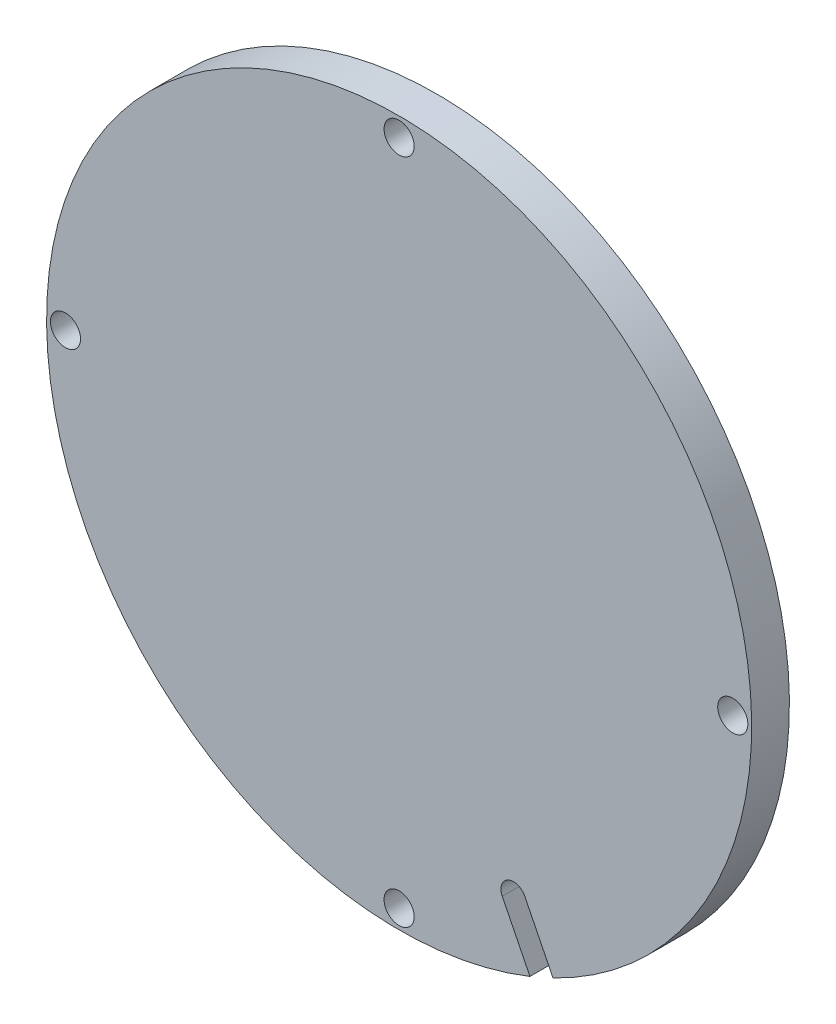
ISO-10303-21;
HEADER;
FILE_DESCRIPTION(('STEP AP214'),'2;1');
FILE_NAME('part.step','',(''),(''),'','','');
FILE_SCHEMA(('AUTOMOTIVE_DESIGN { 1 0 10303 214 1 1 1 1 }'));
ENDSEC;
DATA;
#1=APPLICATION_CONTEXT('core data for automotive mechanical design processes');
#2=APPLICATION_PROTOCOL_DEFINITION('international standard','automotive_design',2000,#1);
#3=PRODUCT_CONTEXT('',#1,'mechanical');
#4=PRODUCT('Part','Part','',(#3));
#5=PRODUCT_RELATED_PRODUCT_CATEGORY('part','',(#4));
#6=PRODUCT_DEFINITION_FORMATION('','',#4);
#7=PRODUCT_DEFINITION_CONTEXT('part definition',#1,'design');
#8=PRODUCT_DEFINITION('design','',#6,#7);
#9=PRODUCT_DEFINITION_SHAPE('','',#8);
#10=(LENGTH_UNIT() NAMED_UNIT(*) SI_UNIT(.MILLI.,.METRE.));
#11=(NAMED_UNIT(*) PLANE_ANGLE_UNIT() SI_UNIT($,.RADIAN.));
#12=(NAMED_UNIT(*) SI_UNIT($,.STERADIAN.) SOLID_ANGLE_UNIT());
#13=UNCERTAINTY_MEASURE_WITH_UNIT(LENGTH_MEASURE(1.E-05),#10,'distance_accuracy_value','');
#14=(GEOMETRIC_REPRESENTATION_CONTEXT(3) GLOBAL_UNCERTAINTY_ASSIGNED_CONTEXT((#13)) GLOBAL_UNIT_ASSIGNED_CONTEXT((#10,
#11,#12)) REPRESENTATION_CONTEXT('',''));
#15=CARTESIAN_POINT('',(0.,0.,0.));
#16=DIRECTION('',(0.,0.,1.));
#17=DIRECTION('',(1.,0.,0.));
#18=AXIS2_PLACEMENT_3D('',#15,#16,#17);
#19=CARTESIAN_POINT('',(0.,0.,4.7625));
#20=DIRECTION('',(0.,0.,-1.));
#21=DIRECTION('',(-1.,0.,0.));
#22=AXIS2_PLACEMENT_3D('',#19,#20,#21);
#23=CYLINDRICAL_SURFACE('',#22,44.45);
#24=CARTESIAN_POINT('',(0.,0.,4.7625));
#25=DIRECTION('',(0.,0.,1.));
#26=DIRECTION('',(1.,0.,0.));
#27=AXIS2_PLACEMENT_3D('',#24,#25,#26);
#28=CIRCLE('',#27,44.45);
#29=CARTESIAN_POINT('',(19.4009427230963,-39.9925733287461,4.7625));
#30=VERTEX_POINT('',#29);
#31=CARTESIAN_POINT('',(16.4941189354782,-41.276464729217,4.7625));
#32=VERTEX_POINT('',#31);
#33=EDGE_CURVE('E101',#30,#32,#28,.T.);
#34=ORIENTED_EDGE('',*,*,#33,.F.);
#35=DIRECTION('',(0.,0.,1.));
#36=VECTOR('',#35,1.);
#37=CARTESIAN_POINT('',(19.4009427230961,-39.9925733287462,2.381256));
#38=LINE('',#37,#36);
#39=CARTESIAN_POINT('',(19.4009427230961,-39.9925733287462,0.));
#40=VERTEX_POINT('',#39);
#41=EDGE_CURVE('E88',#30,#40,#38,.F.);
#42=ORIENTED_EDGE('',*,*,#41,.T.);
#43=CARTESIAN_POINT('',(0.,0.,0.));
#44=DIRECTION('',(0.,0.,1.));
#45=DIRECTION('',(1.,0.,0.));
#46=AXIS2_PLACEMENT_3D('',#43,#44,#45);
#47=CIRCLE('',#46,44.45);
#48=CARTESIAN_POINT('',(16.4941189354782,-41.276464729217,0.));
#49=VERTEX_POINT('',#48);
#50=EDGE_CURVE('E99',#40,#49,#47,.T.);
#51=ORIENTED_EDGE('',*,*,#50,.T.);
#52=DIRECTION('',(0.,0.,-1.));
#53=VECTOR('',#52,1.);
#54=CARTESIAN_POINT('',(16.4941189354782,-41.276464729217,4.7625));
#55=LINE('',#54,#53);
#56=EDGE_CURVE('E78',#32,#49,#55,.T.);
#57=ORIENTED_EDGE('',*,*,#56,.F.);
#58=EDGE_LOOP('',(#34,#42,#51,#57));
#59=FACE_BOUND('',#58,.T.);
#60=ADVANCED_FACE('F33',(#59),#23,.T.);
#61=CARTESIAN_POINT('',(0.,0.,4.7625));
#62=DIRECTION('',(0.,0.,1.));
#63=DIRECTION('',(1.,0.,0.));
#64=AXIS2_PLACEMENT_3D('',#61,#62,#63);
#65=PLANE('',#64);
#66=CARTESIAN_POINT('',(17.9604912281249,-40.6598481901303,4.7625));
#67=DIRECTION('',(0.,0.,1.));
#68=DIRECTION('',(1.,0.,0.));
#69=AXIS2_PLACEMENT_3D('',#66,#67,#68);
#70=CIRCLE('',#69,1.58749999999999);
#71=CARTESIAN_POINT('',(19.3816166533917,-39.9523464052136,4.7625));
#72=VERTEX_POINT('',#71);
#73=EDGE_CURVE('E103',#30,#72,#70,.T.);
#74=ORIENTED_EDGE('',*,*,#73,.F.);
#75=ORIENTED_EDGE('',*,*,#33,.T.);
#76=DIRECTION('',(-0.445670415695608,0.895197118278262,0.));
#77=VECTOR('',#76,1.);
#78=CARTESIAN_POINT('',(-3.24975483302059,-1.61787784809524,4.7625));
#79=LINE('',#78,#77);
#80=CARTESIAN_POINT('',(13.0018568782743,-34.2617228487134,4.7625));
#81=VERTEX_POINT('',#80);
#82=EDGE_CURVE('E115',#32,#81,#79,.T.);
#83=ORIENTED_EDGE('',*,*,#82,.T.);
#84=CARTESIAN_POINT('',(14.4229823035411,-33.5542210637966,4.7625));
#85=DIRECTION('',(0.,0.,1.));
#86=DIRECTION('',(1.,0.,0.));
#87=AXIS2_PLACEMENT_3D('',#84,#85,#86);
#88=CIRCLE('',#87,1.5875);
#89=CARTESIAN_POINT('',(15.8441077288078,-32.8467192788799,4.7625));
#90=VERTEX_POINT('',#89);
#91=EDGE_CURVE('E36',#90,#81,#88,.T.);
#92=ORIENTED_EDGE('',*,*,#91,.F.);
#93=DIRECTION('',(-0.445670415695605,0.895197118278263,0.));
#94=VECTOR('',#93,1.);
#95=CARTESIAN_POINT('',(19.3816166533917,-39.9523464052136,4.7625));
#96=LINE('',#95,#94);
#97=EDGE_CURVE('E66',#72,#90,#96,.T.);
#98=ORIENTED_EDGE('',*,*,#97,.F.);
#99=EDGE_LOOP('',(#74,#75,#83,#92,#98));
#100=FACE_BOUND('',#99,.T.);
#101=CARTESIAN_POINT('',(42.06875,4.40646766720371E-13,4.7625));
#102=DIRECTION('',(0.,0.,1.));
#103=DIRECTION('',(1.,0.,0.));
#104=AXIS2_PLACEMENT_3D('',#101,#102,#103);
#105=CIRCLE('',#104,1.89865);
#106=CARTESIAN_POINT('',(43.9674,4.40646766720371E-13,4.7625));
#107=VERTEX_POINT('',#106);
#108=EDGE_CURVE('E102',#107,#107,#105,.T.);
#109=ORIENTED_EDGE('',*,*,#108,.F.);
#110=EDGE_LOOP('',(#109));
#111=FACE_BOUND('',#110,.T.);
#112=CARTESIAN_POINT('',(0.,-42.06875,4.7625));
#113=DIRECTION('',(0.,0.,1.));
#114=DIRECTION('',(1.,0.,0.));
#115=AXIS2_PLACEMENT_3D('',#112,#113,#114);
#116=CIRCLE('',#115,1.89865);
#117=CARTESIAN_POINT('',(1.89865,-42.06875,4.7625));
#118=VERTEX_POINT('',#117);
#119=EDGE_CURVE('E131',#118,#118,#116,.T.);
#120=ORIENTED_EDGE('',*,*,#119,.F.);
#121=EDGE_LOOP('',(#120));
#122=FACE_BOUND('',#121,.T.);
#123=CARTESIAN_POINT('',(-42.06875,-1.46882255573457E-13,4.7625));
#124=DIRECTION('',(0.,0.,1.));
#125=DIRECTION('',(1.,0.,0.));
#126=AXIS2_PLACEMENT_3D('',#123,#124,#125);
#127=CIRCLE('',#126,1.89865);
#128=CARTESIAN_POINT('',(-40.1701,-1.46882255573457E-13,4.7625));
#129=VERTEX_POINT('',#128);
#130=EDGE_CURVE('E137',#129,#129,#127,.T.);
#131=ORIENTED_EDGE('',*,*,#130,.F.);
#132=EDGE_LOOP('',(#131));
#133=FACE_BOUND('',#132,.T.);
#134=CARTESIAN_POINT('',(0.,42.06875,4.7625));
#135=DIRECTION('',(0.,0.,1.));
#136=DIRECTION('',(1.,0.,0.));
#137=AXIS2_PLACEMENT_3D('',#134,#135,#136);
#138=CIRCLE('',#137,1.89865);
#139=CARTESIAN_POINT('',(1.89865,42.06875,4.7625));
#140=VERTEX_POINT('',#139);
#141=EDGE_CURVE('E110',#140,#140,#138,.T.);
#142=ORIENTED_EDGE('',*,*,#141,.F.);
#143=EDGE_LOOP('',(#142));
#144=FACE_BOUND('',#143,.T.);
#145=ADVANCED_FACE('F148',(#100,#111,#122,#133,#144),#65,.T.);
#146=CARTESIAN_POINT('',(0.,0.,0.));
#147=DIRECTION('',(0.,0.,1.));
#148=DIRECTION('',(1.,0.,0.));
#149=AXIS2_PLACEMENT_3D('',#146,#147,#148);
#150=PLANE('',#149);
#151=CARTESIAN_POINT('',(42.06875,4.40646766720371E-13,0.));
#152=DIRECTION('',(0.,0.,1.));
#153=DIRECTION('',(1.,0.,0.));
#154=AXIS2_PLACEMENT_3D('',#151,#152,#153);
#155=CIRCLE('',#154,1.89865);
#156=CARTESIAN_POINT('',(43.9674,4.40646766720371E-13,0.));
#157=VERTEX_POINT('',#156);
#158=EDGE_CURVE('E128',#157,#157,#155,.T.);
#159=ORIENTED_EDGE('',*,*,#158,.T.);
#160=EDGE_LOOP('',(#159));
#161=FACE_BOUND('',#160,.T.);
#162=CARTESIAN_POINT('',(0.,-42.06875,0.));
#163=DIRECTION('',(0.,0.,1.));
#164=DIRECTION('',(1.,0.,0.));
#165=AXIS2_PLACEMENT_3D('',#162,#163,#164);
#166=CIRCLE('',#165,1.89865);
#167=CARTESIAN_POINT('',(1.89865,-42.06875,0.));
#168=VERTEX_POINT('',#167);
#169=EDGE_CURVE('E134',#168,#168,#166,.T.);
#170=ORIENTED_EDGE('',*,*,#169,.T.);
#171=EDGE_LOOP('',(#170));
#172=FACE_BOUND('',#171,.T.);
#173=CARTESIAN_POINT('',(-42.06875,-1.46882255573457E-13,0.));
#174=DIRECTION('',(0.,0.,1.));
#175=DIRECTION('',(1.,0.,0.));
#176=AXIS2_PLACEMENT_3D('',#173,#174,#175);
#177=CIRCLE('',#176,1.89865);
#178=CARTESIAN_POINT('',(-40.1701,-1.46882255573457E-13,0.));
#179=VERTEX_POINT('',#178);
#180=EDGE_CURVE('E140',#179,#179,#177,.T.);
#181=ORIENTED_EDGE('',*,*,#180,.T.);
#182=EDGE_LOOP('',(#181));
#183=FACE_BOUND('',#182,.T.);
#184=CARTESIAN_POINT('',(0.,42.06875,0.));
#185=DIRECTION('',(0.,0.,1.));
#186=DIRECTION('',(1.,0.,0.));
#187=AXIS2_PLACEMENT_3D('',#184,#185,#186);
#188=CIRCLE('',#187,1.89865);
#189=CARTESIAN_POINT('',(1.89865,42.06875,0.));
#190=VERTEX_POINT('',#189);
#191=EDGE_CURVE('E106',#190,#190,#188,.T.);
#192=ORIENTED_EDGE('',*,*,#191,.T.);
#193=EDGE_LOOP('',(#192));
#194=FACE_BOUND('',#193,.T.);
#195=ORIENTED_EDGE('',*,*,#50,.F.);
#196=CARTESIAN_POINT('',(17.9604912281249,-40.6598481901303,0.));
#197=DIRECTION('',(0.,0.,1.));
#198=DIRECTION('',(1.,0.,0.));
#199=AXIS2_PLACEMENT_3D('',#196,#197,#198);
#200=CIRCLE('',#199,1.58749999999999);
#201=CARTESIAN_POINT('',(19.3816166533917,-39.9523464052136,0.));
#202=VERTEX_POINT('',#201);
#203=EDGE_CURVE('E11',#40,#202,#200,.T.);
#204=ORIENTED_EDGE('',*,*,#203,.T.);
#205=DIRECTION('',(-0.445670415695605,0.895197118278263,0.));
#206=VECTOR('',#205,1.);
#207=CARTESIAN_POINT('',(19.3816166533917,-39.9523464052136,0.));
#208=LINE('',#207,#206);
#209=CARTESIAN_POINT('',(15.8441077288078,-32.8467192788798,0.));
#210=VERTEX_POINT('',#209);
#211=EDGE_CURVE('E263',#202,#210,#208,.T.);
#212=ORIENTED_EDGE('',*,*,#211,.T.);
#213=CARTESIAN_POINT('',(14.4229823035411,-33.5542210637966,0.));
#214=DIRECTION('',(0.,0.,1.));
#215=DIRECTION('',(1.,0.,0.));
#216=AXIS2_PLACEMENT_3D('',#213,#214,#215);
#217=CIRCLE('',#216,1.5875);
#218=CARTESIAN_POINT('',(13.0018568782743,-34.2617228487134,0.));
#219=VERTEX_POINT('',#218);
#220=EDGE_CURVE('E51',#210,#219,#217,.T.);
#221=ORIENTED_EDGE('',*,*,#220,.T.);
#222=DIRECTION('',(-0.445670415695608,0.895197118278262,0.));
#223=VECTOR('',#222,1.);
#224=CARTESIAN_POINT('',(-3.24975483302059,-1.61787784809524,0.));
#225=LINE('',#224,#223);
#226=EDGE_CURVE('E42',#49,#219,#225,.T.);
#227=ORIENTED_EDGE('',*,*,#226,.F.);
#228=EDGE_LOOP('',(#195,#204,#212,#221,#227));
#229=FACE_BOUND('',#228,.T.);
#230=ADVANCED_FACE('F105',(#161,#172,#183,#194,#229),#150,.F.);
#231=CARTESIAN_POINT('',(0.,42.06875,4.7625));
#232=DIRECTION('',(0.,0.,1.));
#233=DIRECTION('',(1.,0.,0.));
#234=AXIS2_PLACEMENT_3D('',#231,#232,#233);
#235=CYLINDRICAL_SURFACE('',#234,1.89865);
#236=ORIENTED_EDGE('',*,*,#191,.F.);
#237=EDGE_LOOP('',(#236));
#238=FACE_BOUND('',#237,.T.);
#239=ORIENTED_EDGE('',*,*,#141,.T.);
#240=EDGE_LOOP('',(#239));
#241=FACE_BOUND('',#240,.T.);
#242=ADVANCED_FACE('F146',(#238,#241),#235,.F.);
#243=CARTESIAN_POINT('',(-42.06875,-1.46882255573457E-13,4.7625));
#244=DIRECTION('',(0.,0.,1.));
#245=DIRECTION('',(1.,0.,0.));
#246=AXIS2_PLACEMENT_3D('',#243,#244,#245);
#247=CYLINDRICAL_SURFACE('',#246,1.89865);
#248=ORIENTED_EDGE('',*,*,#180,.F.);
#249=EDGE_LOOP('',(#248));
#250=FACE_BOUND('',#249,.T.);
#251=ORIENTED_EDGE('',*,*,#130,.T.);
#252=EDGE_LOOP('',(#251));
#253=FACE_BOUND('',#252,.T.);
#254=ADVANCED_FACE('F161',(#250,#253),#247,.F.);
#255=CARTESIAN_POINT('',(0.,-42.06875,4.7625));
#256=DIRECTION('',(0.,0.,1.));
#257=DIRECTION('',(1.,0.,0.));
#258=AXIS2_PLACEMENT_3D('',#255,#256,#257);
#259=CYLINDRICAL_SURFACE('',#258,1.89865);
#260=ORIENTED_EDGE('',*,*,#169,.F.);
#261=EDGE_LOOP('',(#260));
#262=FACE_BOUND('',#261,.T.);
#263=ORIENTED_EDGE('',*,*,#119,.T.);
#264=EDGE_LOOP('',(#263));
#265=FACE_BOUND('',#264,.T.);
#266=ADVANCED_FACE('F165',(#262,#265),#259,.F.);
#267=CARTESIAN_POINT('',(42.06875,4.40646766720371E-13,4.7625));
#268=DIRECTION('',(0.,0.,1.));
#269=DIRECTION('',(1.,0.,0.));
#270=AXIS2_PLACEMENT_3D('',#267,#268,#269);
#271=CYLINDRICAL_SURFACE('',#270,1.89865);
#272=ORIENTED_EDGE('',*,*,#158,.F.);
#273=EDGE_LOOP('',(#272));
#274=FACE_BOUND('',#273,.T.);
#275=ORIENTED_EDGE('',*,*,#108,.T.);
#276=EDGE_LOOP('',(#275));
#277=FACE_BOUND('',#276,.T.);
#278=ADVANCED_FACE('F169',(#274,#277),#271,.F.);
#279=CARTESIAN_POINT('',(17.9604912281249,-40.6598481901303,0.));
#280=DIRECTION('',(0.,0.,1.));
#281=DIRECTION('',(1.,0.,0.));
#282=AXIS2_PLACEMENT_3D('',#279,#280,#281);
#283=CYLINDRICAL_SURFACE('',#282,1.58749999999999);
#284=ORIENTED_EDGE('',*,*,#73,.T.);
#285=DIRECTION('',(0.,0.,1.));
#286=VECTOR('',#285,1.);
#287=CARTESIAN_POINT('',(19.3816166533917,-39.9523464052136,0.));
#288=LINE('',#287,#286);
#289=EDGE_CURVE('E91',#202,#72,#288,.T.);
#290=ORIENTED_EDGE('',*,*,#289,.F.);
#291=ORIENTED_EDGE('',*,*,#203,.F.);
#292=ORIENTED_EDGE('',*,*,#41,.F.);
#293=EDGE_LOOP('',(#284,#290,#291,#292));
#294=FACE_BOUND('',#293,.T.);
#295=ADVANCED_FACE('F87',(#294),#283,.F.);
#296=CARTESIAN_POINT('',(16.5393658028582,-41.3673499750471,0.));
#297=DIRECTION('',(0.895197118278262,0.445670415695608,0.));
#298=DIRECTION('',(-0.445670415695608,0.895197118278262,0.));
#299=AXIS2_PLACEMENT_3D('',#296,#297,#298);
#300=PLANE('',#299);
#301=ORIENTED_EDGE('',*,*,#56,.T.);
#302=ORIENTED_EDGE('',*,*,#226,.T.);
#303=DIRECTION('',(0.,0.,1.));
#304=VECTOR('',#303,1.);
#305=CARTESIAN_POINT('',(13.0018568782743,-34.2617228487134,0.));
#306=LINE('',#305,#304);
#307=EDGE_CURVE('E117',#219,#81,#306,.T.);
#308=ORIENTED_EDGE('',*,*,#307,.T.);
#309=ORIENTED_EDGE('',*,*,#82,.F.);
#310=EDGE_LOOP('',(#301,#302,#308,#309));
#311=FACE_BOUND('',#310,.T.);
#312=ADVANCED_FACE('F176',(#311),#300,.T.);
#313=CARTESIAN_POINT('',(14.4229823035411,-33.5542210637966,0.));
#314=DIRECTION('',(0.,0.,1.));
#315=DIRECTION('',(1.,0.,0.));
#316=AXIS2_PLACEMENT_3D('',#313,#314,#315);
#317=CYLINDRICAL_SURFACE('',#316,1.5875);
#318=ORIENTED_EDGE('',*,*,#91,.T.);
#319=ORIENTED_EDGE('',*,*,#307,.F.);
#320=ORIENTED_EDGE('',*,*,#220,.F.);
#321=DIRECTION('',(0.,0.,1.));
#322=VECTOR('',#321,1.);
#323=CARTESIAN_POINT('',(15.8441077288078,-32.8467192788799,0.));
#324=LINE('',#323,#322);
#325=EDGE_CURVE('E118',#210,#90,#324,.T.);
#326=ORIENTED_EDGE('',*,*,#325,.T.);
#327=EDGE_LOOP('',(#318,#319,#320,#326));
#328=FACE_BOUND('',#327,.T.);
#329=ADVANCED_FACE('F180',(#328),#317,.F.);
#330=CARTESIAN_POINT('',(19.3816166533917,-39.9523464052136,0.));
#331=DIRECTION('',(0.895197118278263,0.445670415695605,0.));
#332=DIRECTION('',(-0.445670415695605,0.895197118278263,0.));
#333=AXIS2_PLACEMENT_3D('',#330,#331,#332);
#334=PLANE('',#333);
#335=ORIENTED_EDGE('',*,*,#97,.T.);
#336=ORIENTED_EDGE('',*,*,#325,.F.);
#337=ORIENTED_EDGE('',*,*,#211,.F.);
#338=ORIENTED_EDGE('',*,*,#289,.T.);
#339=EDGE_LOOP('',(#335,#336,#337,#338));
#340=FACE_BOUND('',#339,.T.);
#341=ADVANCED_FACE('F177',(#340),#334,.F.);
#342=CLOSED_SHELL('',(#60,#145,#230,#242,#254,#266,#278,#295,#312,#329,#341));
#343=MANIFOLD_SOLID_BREP('B2',#342);
#344=ADVANCED_BREP_SHAPE_REPRESENTATION('',(#18,#343),#14);
#345=SHAPE_DEFINITION_REPRESENTATION(#9,#344);
ENDSEC;
END-ISO-10303-21;
